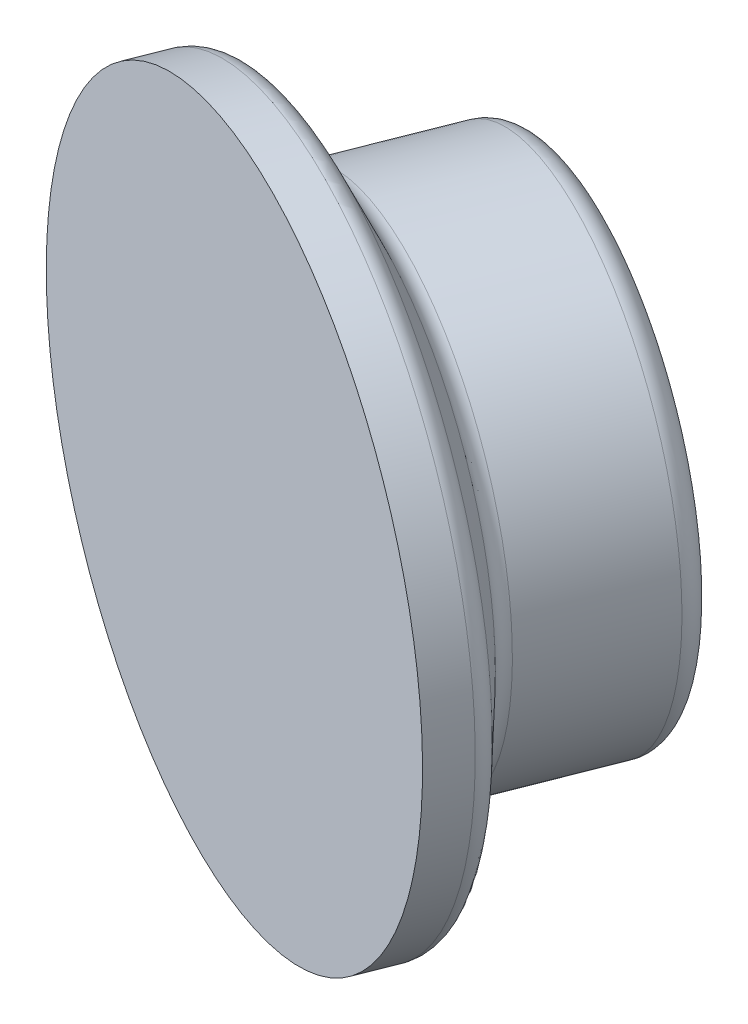
ISO-10303-21;
HEADER;
FILE_DESCRIPTION(('STEP AP214'),'2;1');
FILE_NAME('part.step','',(''),(''),'','','');
FILE_SCHEMA(('AUTOMOTIVE_DESIGN { 1 0 10303 214 1 1 1 1 }'));
ENDSEC;
DATA;
#1=APPLICATION_CONTEXT('core data for automotive mechanical design processes');
#2=APPLICATION_PROTOCOL_DEFINITION('international standard','automotive_design',2000,#1);
#3=PRODUCT_CONTEXT('',#1,'mechanical');
#4=PRODUCT('Part','Part','',(#3));
#5=PRODUCT_RELATED_PRODUCT_CATEGORY('part','',(#4));
#6=PRODUCT_DEFINITION_FORMATION('','',#4);
#7=PRODUCT_DEFINITION_CONTEXT('part definition',#1,'design');
#8=PRODUCT_DEFINITION('design','',#6,#7);
#9=PRODUCT_DEFINITION_SHAPE('','',#8);
#10=(LENGTH_UNIT() NAMED_UNIT(*) SI_UNIT(.MILLI.,.METRE.));
#11=(NAMED_UNIT(*) PLANE_ANGLE_UNIT() SI_UNIT($,.RADIAN.));
#12=(NAMED_UNIT(*) SI_UNIT($,.STERADIAN.) SOLID_ANGLE_UNIT());
#13=UNCERTAINTY_MEASURE_WITH_UNIT(LENGTH_MEASURE(1.E-05),#10,'distance_accuracy_value','');
#14=(GEOMETRIC_REPRESENTATION_CONTEXT(3) GLOBAL_UNCERTAINTY_ASSIGNED_CONTEXT((#13)) GLOBAL_UNIT_ASSIGNED_CONTEXT((#10,
#11,#12)) REPRESENTATION_CONTEXT('',''));
#15=CARTESIAN_POINT('',(0.,0.,0.));
#16=DIRECTION('',(0.,0.,1.));
#17=DIRECTION('',(1.,0.,0.));
#18=AXIS2_PLACEMENT_3D('',#15,#16,#17);
#19=CARTESIAN_POINT('',(26.4342563065949,67.,706.985486595996));
#20=DIRECTION('',(-0.366501226724041,0.,0.930417567982125));
#21=DIRECTION('',(0.,1.,0.));
#22=AXIS2_PLACEMENT_3D('',#19,#20,#21);
#23=PLANE('',#22);
#24=CARTESIAN_POINT('',(26.4342563065949,62.,706.985486595996));
#25=DIRECTION('',(-0.366501226724041,0.,0.930417567982125));
#26=DIRECTION('',(0.930417567982125,0.,0.366501226724041));
#27=AXIS2_PLACEMENT_3D('',#24,#25,#26);
#28=CIRCLE('',#27,4.99999999999972);
#29=CARTESIAN_POINT('',(24.2039265882949,66.3879128094999,706.106936355996));
#30=VERTEX_POINT('',#29);
#31=EDGE_CURVE('E11',#30,#30,#28,.T.);
#32=ORIENTED_EDGE('',*,*,#31,.T.);
#33=EDGE_LOOP('',(#32));
#34=FACE_BOUND('',#33,.T.);
#35=ADVANCED_FACE('F17',(#34),#23,.T.);
#36=CARTESIAN_POINT('',(27.900261213495,62.,703.263816323996));
#37=DIRECTION('',(-0.366501226724041,0.,0.930417567982125));
#38=DIRECTION('',(0.,1.,0.));
#39=AXIS2_PLACEMENT_3D('',#36,#37,#38);
#40=PLANE('',#39);
#41=CARTESIAN_POINT('',(27.900261213495,62.,703.263816323996));
#42=DIRECTION('',(-0.366501226724041,0.,0.930417567982125));
#43=DIRECTION('',(0.930417567982125,0.,0.366501226724041));
#44=AXIS2_PLACEMENT_3D('',#41,#42,#43);
#45=CIRCLE('',#44,3.14999999999982);
#46=CARTESIAN_POINT('',(29.3053689359949,59.2356149299999,703.817302974996));
#47=VERTEX_POINT('',#46);
#48=CARTESIAN_POINT('',(26.4951534908949,64.7643850699999,702.710329671996));
#49=VERTEX_POINT('',#48);
#50=EDGE_CURVE('E83',#47,#49,#45,.T.);
#51=ORIENTED_EDGE('',*,*,#50,.F.);
#52=CARTESIAN_POINT('',(27.900261213495,62.,703.263816323996));
#53=DIRECTION('',(-0.366501226724041,0.,0.930417567982125));
#54=DIRECTION('',(0.930417567982125,0.,0.366501226724041));
#55=AXIS2_PLACEMENT_3D('',#52,#53,#54);
#56=CIRCLE('',#55,3.14999999999982);
#57=EDGE_CURVE('E21',#49,#47,#56,.T.);
#58=ORIENTED_EDGE('',*,*,#57,.F.);
#59=EDGE_LOOP('',(#51,#58));
#60=FACE_BOUND('',#59,.T.);
#61=ADVANCED_FACE('F19',(#60),#40,.F.);
#62=CARTESIAN_POINT('',(27.1672587599949,62.,705.124651459996));
#63=DIRECTION('',(-0.366501226723867,-3.42574005187538E-13,0.930417567982194));
#64=DIRECTION('',(0.446065943657078,-0.877582561890202,0.175710048021027));
#65=AXIS2_PLACEMENT_3D('',#62,#63,#64);
#66=CYLINDRICAL_SURFACE('',#65,4.99999999999994);
#67=ORIENTED_EDGE('',*,*,#31,.F.);
#68=EDGE_LOOP('',(#67));
#69=FACE_BOUND('',#68,.T.);
#70=CARTESIAN_POINT('',(26.6574111782949,62.,706.418974949996));
#71=DIRECTION('',(-0.366501226724041,0.,0.930417567982125));
#72=DIRECTION('',(0.930417567982125,0.,0.366501226724041));
#73=AXIS2_PLACEMENT_3D('',#70,#71,#72);
#74=CIRCLE('',#73,4.99999999999972);
#75=CARTESIAN_POINT('',(24.4270814599949,66.3879128094999,705.540424709996));
#76=VERTEX_POINT('',#75);
#77=EDGE_CURVE('E27',#76,#76,#74,.T.);
#78=ORIENTED_EDGE('',*,*,#77,.T.);
#79=EDGE_LOOP('',(#78));
#80=FACE_BOUND('',#79,.T.);
#81=ADVANCED_FACE('F115',(#69,#80),#66,.T.);
#82=CARTESIAN_POINT('',(26.6574111782949,62.,706.418974949996));
#83=DIRECTION('',(-0.366501226723867,-3.42570952954727E-13,0.930417567982194));
#84=DIRECTION('',(0.446065943657078,-0.877582561890202,0.175710048021027));
#85=AXIS2_PLACEMENT_3D('',#82,#83,#84);
#86=TOROIDAL_SURFACE('',#85,4.7,0.3);
#87=ORIENTED_EDGE('',*,*,#77,.F.);
#88=EDGE_LOOP('',(#87));
#89=FACE_BOUND('',#88,.T.);
#90=CARTESIAN_POINT('',(26.7570600529949,62.,706.166001543996));
#91=DIRECTION('',(-0.366501226724041,0.,0.930417567982125));
#92=DIRECTION('',(0.930417567982125,0.,0.366501226724041));
#93=AXIS2_PLACEMENT_3D('',#90,#91,#92);
#94=CIRCLE('',#93,4.82678547851973);
#95=CARTESIAN_POINT('',(24.6039954336949,66.2359027658999,705.317886835996));
#96=VERTEX_POINT('',#95);
#97=EDGE_CURVE('E78',#96,#96,#94,.T.);
#98=ORIENTED_EDGE('',*,*,#97,.T.);
#99=EDGE_LOOP('',(#98));
#100=FACE_BOUND('',#99,.T.);
#101=ADVANCED_FACE('F93',(#89,#100),#86,.T.);
#102=CARTESIAN_POINT('',(26.9542080159949,62.,705.665512282996));
#103=DIRECTION('',(-0.366501226723867,-3.42516959403978E-13,0.930417567982194));
#104=DIRECTION('',(0.446065943657078,-0.877582561890202,0.175710048021027));
#105=AXIS2_PLACEMENT_3D('',#102,#103,#104);
#106=CONICAL_SURFACE('',#105,3.67321452147995,1.1344640138);
#107=ORIENTED_EDGE('',*,*,#97,.F.);
#108=EDGE_LOOP('',(#107));
#109=FACE_BOUND('',#108,.T.);
#110=CARTESIAN_POINT('',(26.9542080159949,62.,705.665512282996));
#111=DIRECTION('',(-0.366501226724041,0.,0.930417567982125));
#112=DIRECTION('',(0.930417567982125,0.,0.366501226724041));
#113=AXIS2_PLACEMENT_3D('',#110,#111,#112);
#114=CIRCLE('',#113,3.67321452147979);
#115=CARTESIAN_POINT('',(25.3157121141949,65.2235490100999,705.020091582996));
#116=VERTEX_POINT('',#115);
#117=EDGE_CURVE('E73',#116,#116,#114,.T.);
#118=ORIENTED_EDGE('',*,*,#117,.T.);
#119=EDGE_LOOP('',(#118));
#120=FACE_BOUND('',#119,.T.);
#121=ADVANCED_FACE('F95',(#109,#120),#106,.T.);
#122=CARTESIAN_POINT('',(27.0538568906949,62.,705.412538876996));
#123=DIRECTION('',(-0.366501226723867,-3.42626000340191E-13,0.930417567982194));
#124=DIRECTION('',(0.446065943657078,-0.877582561890202,0.175710048021027));
#125=AXIS2_PLACEMENT_3D('',#122,#123,#124);
#126=TOROIDAL_SURFACE('',#125,3.8,0.3);
#127=ORIENTED_EDGE('',*,*,#117,.F.);
#128=EDGE_LOOP('',(#127));
#129=FACE_BOUND('',#128,.T.);
#130=CARTESIAN_POINT('',(27.0538568906949,62.,705.412538876996));
#131=DIRECTION('',(-0.366501226724041,0.,0.930417567982125));
#132=DIRECTION('',(0.930417567982125,0.,0.366501226724041));
#133=AXIS2_PLACEMENT_3D('',#130,#131,#132);
#134=CIRCLE('',#133,3.4999999999998);
#135=CARTESIAN_POINT('',(25.492626087895,65.0715389665999,704.797553708996));
#136=VERTEX_POINT('',#135);
#137=EDGE_CURVE('E69',#136,#136,#134,.T.);
#138=ORIENTED_EDGE('',*,*,#137,.T.);
#139=EDGE_LOOP('',(#138));
#140=FACE_BOUND('',#139,.T.);
#141=ADVANCED_FACE('F70',(#129,#140),#126,.F.);
#142=CARTESIAN_POINT('',(27.1672587599949,62.,705.124651459996));
#143=DIRECTION('',(-0.366501226723868,-3.42495179264284E-13,0.930417567982194));
#144=DIRECTION('',(0.446065943657078,-0.877582561890202,0.175710048021027));
#145=AXIS2_PLACEMENT_3D('',#142,#143,#144);
#146=CYLINDRICAL_SURFACE('',#145,3.49999999999996);
#147=ORIENTED_EDGE('',*,*,#137,.F.);
#148=EDGE_LOOP('',(#147));
#149=FACE_BOUND('',#148,.T.);
#150=CARTESIAN_POINT('',(27.771985784095,62.,703.589462472996));
#151=DIRECTION('',(-0.366501226724041,0.,0.930417567982125));
#152=DIRECTION('',(0.930417567982125,0.,0.366501226724041));
#153=AXIS2_PLACEMENT_3D('',#150,#151,#152);
#154=CIRCLE('',#153,3.4999999999998);
#155=CARTESIAN_POINT('',(26.210754981295,65.0715389665999,702.974477303996));
#156=VERTEX_POINT('',#155);
#157=EDGE_CURVE('E74',#156,#156,#154,.T.);
#158=ORIENTED_EDGE('',*,*,#157,.T.);
#159=EDGE_LOOP('',(#158));
#160=FACE_BOUND('',#159,.T.);
#161=ADVANCED_FACE('F102',(#149,#160),#146,.T.);
#162=CARTESIAN_POINT('',(27.771985784095,62.,703.589462472996));
#163=DIRECTION('',(-0.366501226723868,-3.42633256945523E-13,0.930417567982194));
#164=DIRECTION('',(0.446065943657078,-0.877582561890202,0.175710048021027));
#165=AXIS2_PLACEMENT_3D('',#162,#163,#164);
#166=TOROIDAL_SURFACE('',#165,3.15,0.35);
#167=ORIENTED_EDGE('',*,*,#157,.F.);
#168=EDGE_LOOP('',(#167));
#169=FACE_BOUND('',#168,.T.);
#170=ORIENTED_EDGE('',*,*,#50,.T.);
#171=ORIENTED_EDGE('',*,*,#57,.T.);
#172=EDGE_LOOP('',(#170,#171));
#173=FACE_BOUND('',#172,.T.);
#174=ADVANCED_FACE('F108',(#169,#173),#166,.T.);
#175=CLOSED_SHELL('',(#35,#61,#81,#101,#121,#141,#161,#174));
#176=MANIFOLD_SOLID_BREP('B1',#175);
#177=ADVANCED_BREP_SHAPE_REPRESENTATION('',(#18,#176),#14);
#178=SHAPE_DEFINITION_REPRESENTATION(#9,#177);
ENDSEC;
END-ISO-10303-21;
